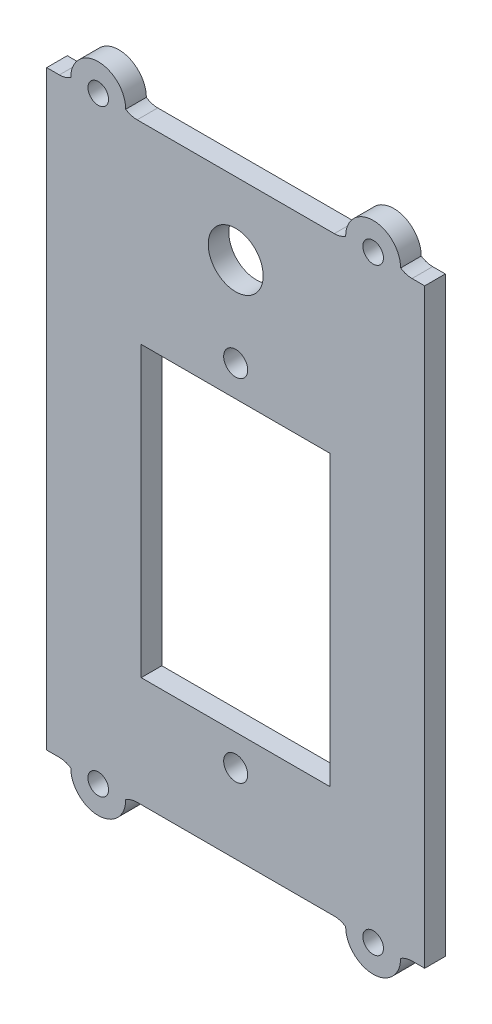
ISO-10303-21;
HEADER;
FILE_DESCRIPTION(('STEP AP214'),'2;1');
FILE_NAME('part.step','',(''),(''),'','','');
FILE_SCHEMA(('AUTOMOTIVE_DESIGN { 1 0 10303 214 1 1 1 1 }'));
ENDSEC;
DATA;
#1=APPLICATION_CONTEXT('core data for automotive mechanical design processes');
#2=APPLICATION_PROTOCOL_DEFINITION('international standard','automotive_design',2000,#1);
#3=PRODUCT_CONTEXT('',#1,'mechanical');
#4=PRODUCT('Part','Part','',(#3));
#5=PRODUCT_RELATED_PRODUCT_CATEGORY('part','',(#4));
#6=PRODUCT_DEFINITION_FORMATION('','',#4);
#7=PRODUCT_DEFINITION_CONTEXT('part definition',#1,'design');
#8=PRODUCT_DEFINITION('design','',#6,#7);
#9=PRODUCT_DEFINITION_SHAPE('','',#8);
#10=(LENGTH_UNIT() NAMED_UNIT(*) SI_UNIT(.MILLI.,.METRE.));
#11=(NAMED_UNIT(*) PLANE_ANGLE_UNIT() SI_UNIT($,.RADIAN.));
#12=(NAMED_UNIT(*) SI_UNIT($,.STERADIAN.) SOLID_ANGLE_UNIT());
#13=UNCERTAINTY_MEASURE_WITH_UNIT(LENGTH_MEASURE(1.E-05),#10,'distance_accuracy_value','');
#14=(GEOMETRIC_REPRESENTATION_CONTEXT(3) GLOBAL_UNCERTAINTY_ASSIGNED_CONTEXT((#13)) GLOBAL_UNIT_ASSIGNED_CONTEXT((#10,
#11,#12)) REPRESENTATION_CONTEXT('',''));
#15=CARTESIAN_POINT('',(0.,0.,0.));
#16=DIRECTION('',(0.,0.,1.));
#17=DIRECTION('',(1.,0.,0.));
#18=AXIS2_PLACEMENT_3D('',#15,#16,#17);
#19=CARTESIAN_POINT('',(-14.3416876048223,-46.,3.));
#20=DIRECTION('',(0.,0.,-1.));
#21=DIRECTION('',(-1.,0.,0.));
#22=AXIS2_PLACEMENT_3D('',#19,#20,#21);
#23=CYLINDRICAL_SURFACE('',#22,3.);
#24=CARTESIAN_POINT('',(-14.3416876048223,-46.,0.));
#25=DIRECTION('',(0.,0.,1.));
#26=DIRECTION('',(1.,0.,0.));
#27=AXIS2_PLACEMENT_3D('',#24,#25,#26);
#28=CIRCLE('',#27,3.);
#29=CARTESIAN_POINT('',(-14.3416876048223,-43.,0.));
#30=VERTEX_POINT('',#29);
#31=CARTESIAN_POINT('',(-16.,-43.5,0.));
#32=VERTEX_POINT('',#31);
#33=EDGE_CURVE('E305',#30,#32,#28,.T.);
#34=ORIENTED_EDGE('',*,*,#33,.F.);
#35=DIRECTION('',(0.,0.,-1.));
#36=VECTOR('',#35,1.);
#37=CARTESIAN_POINT('',(-14.3416876048223,-43.,3.));
#38=LINE('',#37,#36);
#39=CARTESIAN_POINT('',(-14.3416876048223,-43.,3.));
#40=VERTEX_POINT('',#39);
#41=EDGE_CURVE('E11',#40,#30,#38,.T.);
#42=ORIENTED_EDGE('',*,*,#41,.F.);
#43=CARTESIAN_POINT('',(-14.3416876048223,-46.,3.));
#44=DIRECTION('',(0.,0.,1.));
#45=DIRECTION('',(1.,0.,0.));
#46=AXIS2_PLACEMENT_3D('',#43,#44,#45);
#47=CIRCLE('',#46,3.);
#48=CARTESIAN_POINT('',(-16.,-43.5,3.));
#49=VERTEX_POINT('',#48);
#50=EDGE_CURVE('E243',#40,#49,#47,.T.);
#51=ORIENTED_EDGE('',*,*,#50,.T.);
#52=DIRECTION('',(0.,0.,-1.));
#53=VECTOR('',#52,1.);
#54=CARTESIAN_POINT('',(-16.,-43.5,3.));
#55=LINE('',#54,#53);
#56=EDGE_CURVE('E304',#49,#32,#55,.T.);
#57=ORIENTED_EDGE('',*,*,#56,.T.);
#58=EDGE_LOOP('',(#34,#42,#51,#57));
#59=FACE_BOUND('',#58,.T.);
#60=ADVANCED_FACE('F33',(#59),#23,.F.);
#61=CARTESIAN_POINT('',(0.,-43.,3.));
#62=DIRECTION('',(0.,1.,0.));
#63=DIRECTION('',(0.,0.,1.));
#64=AXIS2_PLACEMENT_3D('',#61,#62,#63);
#65=PLANE('',#64);
#66=DIRECTION('',(1.,0.,0.));
#67=VECTOR('',#66,1.);
#68=CARTESIAN_POINT('',(0.,-43.,0.));
#69=LINE('',#68,#67);
#70=CARTESIAN_POINT('',(14.3416876048223,-43.,0.));
#71=VERTEX_POINT('',#70);
#72=EDGE_CURVE('E308',#30,#71,#69,.T.);
#73=ORIENTED_EDGE('',*,*,#72,.T.);
#74=DIRECTION('',(0.,0.,-1.));
#75=VECTOR('',#74,1.);
#76=CARTESIAN_POINT('',(14.3416876048223,-43.,3.));
#77=LINE('',#76,#75);
#78=CARTESIAN_POINT('',(14.3416876048223,-43.,3.));
#79=VERTEX_POINT('',#78);
#80=EDGE_CURVE('E40',#79,#71,#77,.T.);
#81=ORIENTED_EDGE('',*,*,#80,.F.);
#82=DIRECTION('',(1.,0.,0.));
#83=VECTOR('',#82,1.);
#84=CARTESIAN_POINT('',(0.,-43.,3.));
#85=LINE('',#84,#83);
#86=EDGE_CURVE('E246',#40,#79,#85,.T.);
#87=ORIENTED_EDGE('',*,*,#86,.F.);
#88=ORIENTED_EDGE('',*,*,#41,.T.);
#89=EDGE_LOOP('',(#73,#81,#87,#88));
#90=FACE_BOUND('',#89,.T.);
#91=ADVANCED_FACE('F419',(#90),#65,.F.);
#92=CARTESIAN_POINT('',(14.3416876048223,-46.,3.));
#93=DIRECTION('',(0.,0.,-1.));
#94=DIRECTION('',(-1.,0.,0.));
#95=AXIS2_PLACEMENT_3D('',#92,#93,#94);
#96=CYLINDRICAL_SURFACE('',#95,3.);
#97=CARTESIAN_POINT('',(14.3416876048223,-46.,0.));
#98=DIRECTION('',(0.,0.,1.));
#99=DIRECTION('',(1.,0.,0.));
#100=AXIS2_PLACEMENT_3D('',#97,#98,#99);
#101=CIRCLE('',#100,3.);
#102=CARTESIAN_POINT('',(16.,-43.5,0.));
#103=VERTEX_POINT('',#102);
#104=EDGE_CURVE('E312',#103,#71,#101,.T.);
#105=ORIENTED_EDGE('',*,*,#104,.F.);
#106=DIRECTION('',(0.,0.,-1.));
#107=VECTOR('',#106,1.);
#108=CARTESIAN_POINT('',(16.,-43.5,3.));
#109=LINE('',#108,#107);
#110=CARTESIAN_POINT('',(16.,-43.5,3.));
#111=VERTEX_POINT('',#110);
#112=EDGE_CURVE('E410',#111,#103,#109,.T.);
#113=ORIENTED_EDGE('',*,*,#112,.F.);
#114=CARTESIAN_POINT('',(14.3416876048223,-46.,3.));
#115=DIRECTION('',(0.,0.,1.));
#116=DIRECTION('',(1.,0.,0.));
#117=AXIS2_PLACEMENT_3D('',#114,#115,#116);
#118=CIRCLE('',#117,3.);
#119=EDGE_CURVE('E249',#111,#79,#118,.T.);
#120=ORIENTED_EDGE('',*,*,#119,.T.);
#121=ORIENTED_EDGE('',*,*,#80,.T.);
#122=EDGE_LOOP('',(#105,#113,#120,#121));
#123=FACE_BOUND('',#122,.T.);
#124=ADVANCED_FACE('F414',(#123),#96,.F.);
#125=CARTESIAN_POINT('',(20.,-43.5,3.));
#126=DIRECTION('',(0.,0.,-1.));
#127=DIRECTION('',(-1.,0.,0.));
#128=AXIS2_PLACEMENT_3D('',#125,#126,#127);
#129=CYLINDRICAL_SURFACE('',#128,4.);
#130=CARTESIAN_POINT('',(20.,-43.5,0.));
#131=DIRECTION('',(0.,0.,1.));
#132=DIRECTION('',(1.,0.,0.));
#133=AXIS2_PLACEMENT_3D('',#130,#131,#132);
#134=CIRCLE('',#133,4.);
#135=CARTESIAN_POINT('',(24.,-43.5,0.));
#136=VERTEX_POINT('',#135);
#137=EDGE_CURVE('E315',#103,#136,#134,.T.);
#138=ORIENTED_EDGE('',*,*,#137,.T.);
#139=DIRECTION('',(0.,0.,-1.));
#140=VECTOR('',#139,1.);
#141=CARTESIAN_POINT('',(24.,-43.5,3.));
#142=LINE('',#141,#140);
#143=CARTESIAN_POINT('',(24.,-43.5,3.));
#144=VERTEX_POINT('',#143);
#145=EDGE_CURVE('E408',#144,#136,#142,.T.);
#146=ORIENTED_EDGE('',*,*,#145,.F.);
#147=CARTESIAN_POINT('',(20.,-43.5,3.));
#148=DIRECTION('',(0.,0.,1.));
#149=DIRECTION('',(1.,0.,0.));
#150=AXIS2_PLACEMENT_3D('',#147,#148,#149);
#151=CIRCLE('',#150,4.);
#152=EDGE_CURVE('E252',#111,#144,#151,.T.);
#153=ORIENTED_EDGE('',*,*,#152,.F.);
#154=ORIENTED_EDGE('',*,*,#112,.T.);
#155=EDGE_LOOP('',(#138,#146,#153,#154));
#156=FACE_BOUND('',#155,.T.);
#157=ADVANCED_FACE('F429',(#156),#129,.T.);
#158=CARTESIAN_POINT('',(25.6583123951777,-46.,3.));
#159=DIRECTION('',(0.,0.,-1.));
#160=DIRECTION('',(-1.,0.,0.));
#161=AXIS2_PLACEMENT_3D('',#158,#159,#160);
#162=CYLINDRICAL_SURFACE('',#161,3.);
#163=CARTESIAN_POINT('',(25.6583123951777,-46.,0.));
#164=DIRECTION('',(0.,0.,1.));
#165=DIRECTION('',(1.,0.,0.));
#166=AXIS2_PLACEMENT_3D('',#163,#164,#165);
#167=CIRCLE('',#166,3.);
#168=CARTESIAN_POINT('',(25.6583123951777,-43.,0.));
#169=VERTEX_POINT('',#168);
#170=EDGE_CURVE('E318',#169,#136,#167,.T.);
#171=ORIENTED_EDGE('',*,*,#170,.F.);
#172=DIRECTION('',(0.,0.,-1.));
#173=VECTOR('',#172,1.);
#174=CARTESIAN_POINT('',(25.6583123951777,-43.,3.));
#175=LINE('',#174,#173);
#176=CARTESIAN_POINT('',(25.6583123951777,-43.,3.));
#177=VERTEX_POINT('',#176);
#178=EDGE_CURVE('E406',#177,#169,#175,.T.);
#179=ORIENTED_EDGE('',*,*,#178,.F.);
#180=CARTESIAN_POINT('',(25.6583123951777,-46.,3.));
#181=DIRECTION('',(0.,0.,1.));
#182=DIRECTION('',(1.,0.,0.));
#183=AXIS2_PLACEMENT_3D('',#180,#181,#182);
#184=CIRCLE('',#183,3.);
#185=EDGE_CURVE('E254',#177,#144,#184,.T.);
#186=ORIENTED_EDGE('',*,*,#185,.T.);
#187=ORIENTED_EDGE('',*,*,#145,.T.);
#188=EDGE_LOOP('',(#171,#179,#186,#187));
#189=FACE_BOUND('',#188,.T.);
#190=ADVANCED_FACE('F504',(#189),#162,.F.);
#191=CARTESIAN_POINT('',(0.,-43.,3.));
#192=DIRECTION('',(0.,1.,0.));
#193=DIRECTION('',(0.,0.,1.));
#194=AXIS2_PLACEMENT_3D('',#191,#192,#193);
#195=PLANE('',#194);
#196=DIRECTION('',(1.,0.,0.));
#197=VECTOR('',#196,1.);
#198=CARTESIAN_POINT('',(0.,-43.,0.));
#199=LINE('',#198,#197);
#200=CARTESIAN_POINT('',(27.5,-43.,0.));
#201=VERTEX_POINT('',#200);
#202=EDGE_CURVE('E321',#169,#201,#199,.T.);
#203=ORIENTED_EDGE('',*,*,#202,.T.);
#204=DIRECTION('',(0.,0.,-1.));
#205=VECTOR('',#204,1.);
#206=CARTESIAN_POINT('',(27.5,-43.,3.));
#207=LINE('',#206,#205);
#208=CARTESIAN_POINT('',(27.5,-43.,3.));
#209=VERTEX_POINT('',#208);
#210=EDGE_CURVE('E403',#209,#201,#207,.T.);
#211=ORIENTED_EDGE('',*,*,#210,.F.);
#212=DIRECTION('',(1.,0.,0.));
#213=VECTOR('',#212,1.);
#214=CARTESIAN_POINT('',(0.,-43.,3.));
#215=LINE('',#214,#213);
#216=EDGE_CURVE('E257',#177,#209,#215,.T.);
#217=ORIENTED_EDGE('',*,*,#216,.F.);
#218=ORIENTED_EDGE('',*,*,#178,.T.);
#219=EDGE_LOOP('',(#203,#211,#217,#218));
#220=FACE_BOUND('',#219,.T.);
#221=ADVANCED_FACE('F502',(#220),#195,.F.);
#222=CARTESIAN_POINT('',(27.5,0.,3.));
#223=DIRECTION('',(-1.,0.,0.));
#224=DIRECTION('',(0.,-1.,0.));
#225=AXIS2_PLACEMENT_3D('',#222,#223,#224);
#226=PLANE('',#225);
#227=DIRECTION('',(0.,1.,0.));
#228=VECTOR('',#227,1.);
#229=CARTESIAN_POINT('',(27.5,0.,0.));
#230=LINE('',#229,#228);
#231=CARTESIAN_POINT('',(27.5,43.,0.));
#232=VERTEX_POINT('',#231);
#233=EDGE_CURVE('E323',#201,#232,#230,.T.);
#234=ORIENTED_EDGE('',*,*,#233,.T.);
#235=DIRECTION('',(0.,0.,-1.));
#236=VECTOR('',#235,1.);
#237=CARTESIAN_POINT('',(27.5,43.,3.));
#238=LINE('',#237,#236);
#239=CARTESIAN_POINT('',(27.5,43.,3.));
#240=VERTEX_POINT('',#239);
#241=EDGE_CURVE('E400',#240,#232,#238,.T.);
#242=ORIENTED_EDGE('',*,*,#241,.F.);
#243=DIRECTION('',(0.,1.,0.));
#244=VECTOR('',#243,1.);
#245=CARTESIAN_POINT('',(27.5,0.,3.));
#246=LINE('',#245,#244);
#247=EDGE_CURVE('E259',#209,#240,#246,.T.);
#248=ORIENTED_EDGE('',*,*,#247,.F.);
#249=ORIENTED_EDGE('',*,*,#210,.T.);
#250=EDGE_LOOP('',(#234,#242,#248,#249));
#251=FACE_BOUND('',#250,.T.);
#252=ADVANCED_FACE('F497',(#251),#226,.F.);
#253=CARTESIAN_POINT('',(0.,43.,3.));
#254=DIRECTION('',(0.,-1.,0.));
#255=DIRECTION('',(0.,0.,-1.));
#256=AXIS2_PLACEMENT_3D('',#253,#254,#255);
#257=PLANE('',#256);
#258=DIRECTION('',(-1.,0.,0.));
#259=VECTOR('',#258,1.);
#260=CARTESIAN_POINT('',(0.,43.,0.));
#261=LINE('',#260,#259);
#262=CARTESIAN_POINT('',(25.6583123951777,43.,0.));
#263=VERTEX_POINT('',#262);
#264=EDGE_CURVE('E325',#232,#263,#261,.T.);
#265=ORIENTED_EDGE('',*,*,#264,.T.);
#266=DIRECTION('',(0.,0.,-1.));
#267=VECTOR('',#266,1.);
#268=CARTESIAN_POINT('',(25.6583123951777,43.,3.));
#269=LINE('',#268,#267);
#270=CARTESIAN_POINT('',(25.6583123951777,43.,3.));
#271=VERTEX_POINT('',#270);
#272=EDGE_CURVE('E398',#271,#263,#269,.T.);
#273=ORIENTED_EDGE('',*,*,#272,.F.);
#274=DIRECTION('',(-1.,0.,0.));
#275=VECTOR('',#274,1.);
#276=CARTESIAN_POINT('',(0.,43.,3.));
#277=LINE('',#276,#275);
#278=EDGE_CURVE('E261',#240,#271,#277,.T.);
#279=ORIENTED_EDGE('',*,*,#278,.F.);
#280=ORIENTED_EDGE('',*,*,#241,.T.);
#281=EDGE_LOOP('',(#265,#273,#279,#280));
#282=FACE_BOUND('',#281,.T.);
#283=ADVANCED_FACE('F493',(#282),#257,.F.);
#284=CARTESIAN_POINT('',(25.6583123951777,46.,3.));
#285=DIRECTION('',(0.,0.,-1.));
#286=DIRECTION('',(-1.,0.,0.));
#287=AXIS2_PLACEMENT_3D('',#284,#285,#286);
#288=CYLINDRICAL_SURFACE('',#287,3.);
#289=CARTESIAN_POINT('',(25.6583123951777,46.,0.));
#290=DIRECTION('',(0.,0.,1.));
#291=DIRECTION('',(1.,0.,0.));
#292=AXIS2_PLACEMENT_3D('',#289,#290,#291);
#293=CIRCLE('',#292,3.);
#294=CARTESIAN_POINT('',(24.,43.5,0.));
#295=VERTEX_POINT('',#294);
#296=EDGE_CURVE('E328',#295,#263,#293,.T.);
#297=ORIENTED_EDGE('',*,*,#296,.F.);
#298=DIRECTION('',(0.,0.,-1.));
#299=VECTOR('',#298,1.);
#300=CARTESIAN_POINT('',(24.,43.5,3.));
#301=LINE('',#300,#299);
#302=CARTESIAN_POINT('',(24.,43.5,3.));
#303=VERTEX_POINT('',#302);
#304=EDGE_CURVE('E396',#303,#295,#301,.T.);
#305=ORIENTED_EDGE('',*,*,#304,.F.);
#306=CARTESIAN_POINT('',(25.6583123951777,46.,3.));
#307=DIRECTION('',(0.,0.,1.));
#308=DIRECTION('',(1.,0.,0.));
#309=AXIS2_PLACEMENT_3D('',#306,#307,#308);
#310=CIRCLE('',#309,3.);
#311=EDGE_CURVE('E263',#303,#271,#310,.T.);
#312=ORIENTED_EDGE('',*,*,#311,.T.);
#313=ORIENTED_EDGE('',*,*,#272,.T.);
#314=EDGE_LOOP('',(#297,#305,#312,#313));
#315=FACE_BOUND('',#314,.T.);
#316=ADVANCED_FACE('F488',(#315),#288,.F.);
#317=CARTESIAN_POINT('',(20.,43.5,3.));
#318=DIRECTION('',(0.,0.,-1.));
#319=DIRECTION('',(-1.,0.,0.));
#320=AXIS2_PLACEMENT_3D('',#317,#318,#319);
#321=CYLINDRICAL_SURFACE('',#320,4.);
#322=CARTESIAN_POINT('',(20.,43.5,0.));
#323=DIRECTION('',(0.,0.,1.));
#324=DIRECTION('',(1.,0.,0.));
#325=AXIS2_PLACEMENT_3D('',#322,#323,#324);
#326=CIRCLE('',#325,4.);
#327=CARTESIAN_POINT('',(16.,43.5,0.));
#328=VERTEX_POINT('',#327);
#329=EDGE_CURVE('E331',#295,#328,#326,.T.);
#330=ORIENTED_EDGE('',*,*,#329,.T.);
#331=DIRECTION('',(0.,0.,-1.));
#332=VECTOR('',#331,1.);
#333=CARTESIAN_POINT('',(16.,43.5,3.));
#334=LINE('',#333,#332);
#335=CARTESIAN_POINT('',(16.,43.5,3.));
#336=VERTEX_POINT('',#335);
#337=EDGE_CURVE('E394',#336,#328,#334,.T.);
#338=ORIENTED_EDGE('',*,*,#337,.F.);
#339=CARTESIAN_POINT('',(20.,43.5,3.));
#340=DIRECTION('',(0.,0.,1.));
#341=DIRECTION('',(1.,0.,0.));
#342=AXIS2_PLACEMENT_3D('',#339,#340,#341);
#343=CIRCLE('',#342,4.);
#344=EDGE_CURVE('E266',#303,#336,#343,.T.);
#345=ORIENTED_EDGE('',*,*,#344,.F.);
#346=ORIENTED_EDGE('',*,*,#304,.T.);
#347=EDGE_LOOP('',(#330,#338,#345,#346));
#348=FACE_BOUND('',#347,.T.);
#349=ADVANCED_FACE('F484',(#348),#321,.T.);
#350=CARTESIAN_POINT('',(14.3416876048223,46.,3.));
#351=DIRECTION('',(0.,0.,-1.));
#352=DIRECTION('',(-1.,0.,0.));
#353=AXIS2_PLACEMENT_3D('',#350,#351,#352);
#354=CYLINDRICAL_SURFACE('',#353,3.);
#355=CARTESIAN_POINT('',(14.3416876048223,46.,0.));
#356=DIRECTION('',(0.,0.,1.));
#357=DIRECTION('',(1.,0.,0.));
#358=AXIS2_PLACEMENT_3D('',#355,#356,#357);
#359=CIRCLE('',#358,3.);
#360=CARTESIAN_POINT('',(14.3416876048223,43.,0.));
#361=VERTEX_POINT('',#360);
#362=EDGE_CURVE('E334',#361,#328,#359,.T.);
#363=ORIENTED_EDGE('',*,*,#362,.F.);
#364=DIRECTION('',(0.,0.,-1.));
#365=VECTOR('',#364,1.);
#366=CARTESIAN_POINT('',(14.3416876048223,43.,3.));
#367=LINE('',#366,#365);
#368=CARTESIAN_POINT('',(14.3416876048223,43.,3.));
#369=VERTEX_POINT('',#368);
#370=EDGE_CURVE('E392',#369,#361,#367,.T.);
#371=ORIENTED_EDGE('',*,*,#370,.F.);
#372=CARTESIAN_POINT('',(14.3416876048223,46.,3.));
#373=DIRECTION('',(0.,0.,1.));
#374=DIRECTION('',(1.,0.,0.));
#375=AXIS2_PLACEMENT_3D('',#372,#373,#374);
#376=CIRCLE('',#375,3.);
#377=EDGE_CURVE('E268',#369,#336,#376,.T.);
#378=ORIENTED_EDGE('',*,*,#377,.T.);
#379=ORIENTED_EDGE('',*,*,#337,.T.);
#380=EDGE_LOOP('',(#363,#371,#378,#379));
#381=FACE_BOUND('',#380,.T.);
#382=ADVANCED_FACE('F479',(#381),#354,.F.);
#383=CARTESIAN_POINT('',(0.,43.,3.));
#384=DIRECTION('',(0.,-1.,0.));
#385=DIRECTION('',(0.,0.,-1.));
#386=AXIS2_PLACEMENT_3D('',#383,#384,#385);
#387=PLANE('',#386);
#388=DIRECTION('',(-1.,0.,0.));
#389=VECTOR('',#388,1.);
#390=CARTESIAN_POINT('',(0.,43.,0.));
#391=LINE('',#390,#389);
#392=CARTESIAN_POINT('',(-14.3416876048223,43.,0.));
#393=VERTEX_POINT('',#392);
#394=EDGE_CURVE('E337',#361,#393,#391,.T.);
#395=ORIENTED_EDGE('',*,*,#394,.T.);
#396=DIRECTION('',(0.,0.,-1.));
#397=VECTOR('',#396,1.);
#398=CARTESIAN_POINT('',(-14.3416876048223,43.,3.));
#399=LINE('',#398,#397);
#400=CARTESIAN_POINT('',(-14.3416876048223,43.,3.));
#401=VERTEX_POINT('',#400);
#402=EDGE_CURVE('E390',#401,#393,#399,.T.);
#403=ORIENTED_EDGE('',*,*,#402,.F.);
#404=DIRECTION('',(-1.,0.,0.));
#405=VECTOR('',#404,1.);
#406=CARTESIAN_POINT('',(0.,43.,3.));
#407=LINE('',#406,#405);
#408=EDGE_CURVE('E271',#369,#401,#407,.T.);
#409=ORIENTED_EDGE('',*,*,#408,.F.);
#410=ORIENTED_EDGE('',*,*,#370,.T.);
#411=EDGE_LOOP('',(#395,#403,#409,#410));
#412=FACE_BOUND('',#411,.T.);
#413=ADVANCED_FACE('F475',(#412),#387,.F.);
#414=CARTESIAN_POINT('',(-14.3416876048223,46.,3.));
#415=DIRECTION('',(0.,0.,-1.));
#416=DIRECTION('',(-1.,0.,0.));
#417=AXIS2_PLACEMENT_3D('',#414,#415,#416);
#418=CYLINDRICAL_SURFACE('',#417,3.);
#419=CARTESIAN_POINT('',(-14.3416876048223,46.,0.));
#420=DIRECTION('',(0.,0.,1.));
#421=DIRECTION('',(1.,0.,0.));
#422=AXIS2_PLACEMENT_3D('',#419,#420,#421);
#423=CIRCLE('',#422,3.);
#424=CARTESIAN_POINT('',(-16.,43.5,0.));
#425=VERTEX_POINT('',#424);
#426=EDGE_CURVE('E340',#425,#393,#423,.T.);
#427=ORIENTED_EDGE('',*,*,#426,.F.);
#428=DIRECTION('',(0.,0.,-1.));
#429=VECTOR('',#428,1.);
#430=CARTESIAN_POINT('',(-16.,43.5,3.));
#431=LINE('',#430,#429);
#432=CARTESIAN_POINT('',(-16.,43.5,3.));
#433=VERTEX_POINT('',#432);
#434=EDGE_CURVE('E388',#433,#425,#431,.T.);
#435=ORIENTED_EDGE('',*,*,#434,.F.);
#436=CARTESIAN_POINT('',(-14.3416876048223,46.,3.));
#437=DIRECTION('',(0.,0.,1.));
#438=DIRECTION('',(1.,0.,0.));
#439=AXIS2_PLACEMENT_3D('',#436,#437,#438);
#440=CIRCLE('',#439,3.);
#441=EDGE_CURVE('E273',#433,#401,#440,.T.);
#442=ORIENTED_EDGE('',*,*,#441,.T.);
#443=ORIENTED_EDGE('',*,*,#402,.T.);
#444=EDGE_LOOP('',(#427,#435,#442,#443));
#445=FACE_BOUND('',#444,.T.);
#446=ADVANCED_FACE('F469',(#445),#418,.F.);
#447=CARTESIAN_POINT('',(-20.,43.5,3.));
#448=DIRECTION('',(0.,0.,-1.));
#449=DIRECTION('',(-1.,0.,0.));
#450=AXIS2_PLACEMENT_3D('',#447,#448,#449);
#451=CYLINDRICAL_SURFACE('',#450,4.);
#452=CARTESIAN_POINT('',(-20.,43.5,0.));
#453=DIRECTION('',(0.,0.,1.));
#454=DIRECTION('',(1.,0.,0.));
#455=AXIS2_PLACEMENT_3D('',#452,#453,#454);
#456=CIRCLE('',#455,4.);
#457=CARTESIAN_POINT('',(-24.,43.5,0.));
#458=VERTEX_POINT('',#457);
#459=EDGE_CURVE('E343',#425,#458,#456,.T.);
#460=ORIENTED_EDGE('',*,*,#459,.T.);
#461=DIRECTION('',(0.,0.,-1.));
#462=VECTOR('',#461,1.);
#463=CARTESIAN_POINT('',(-24.,43.5,3.));
#464=LINE('',#463,#462);
#465=CARTESIAN_POINT('',(-24.,43.5,3.));
#466=VERTEX_POINT('',#465);
#467=EDGE_CURVE('E386',#466,#458,#464,.T.);
#468=ORIENTED_EDGE('',*,*,#467,.F.);
#469=CARTESIAN_POINT('',(-20.,43.5,3.));
#470=DIRECTION('',(0.,0.,1.));
#471=DIRECTION('',(1.,0.,0.));
#472=AXIS2_PLACEMENT_3D('',#469,#470,#471);
#473=CIRCLE('',#472,4.);
#474=EDGE_CURVE('E276',#433,#466,#473,.T.);
#475=ORIENTED_EDGE('',*,*,#474,.F.);
#476=ORIENTED_EDGE('',*,*,#434,.T.);
#477=EDGE_LOOP('',(#460,#468,#475,#476));
#478=FACE_BOUND('',#477,.T.);
#479=ADVANCED_FACE('F505',(#478),#451,.T.);
#480=CARTESIAN_POINT('',(-25.6583123951777,46.,3.));
#481=DIRECTION('',(0.,0.,-1.));
#482=DIRECTION('',(-1.,0.,0.));
#483=AXIS2_PLACEMENT_3D('',#480,#481,#482);
#484=CYLINDRICAL_SURFACE('',#483,3.);
#485=CARTESIAN_POINT('',(-25.6583123951777,46.,0.));
#486=DIRECTION('',(0.,0.,1.));
#487=DIRECTION('',(1.,0.,0.));
#488=AXIS2_PLACEMENT_3D('',#485,#486,#487);
#489=CIRCLE('',#488,3.);
#490=CARTESIAN_POINT('',(-25.6583123951777,43.,0.));
#491=VERTEX_POINT('',#490);
#492=EDGE_CURVE('E346',#491,#458,#489,.T.);
#493=ORIENTED_EDGE('',*,*,#492,.F.);
#494=DIRECTION('',(0.,0.,-1.));
#495=VECTOR('',#494,1.);
#496=CARTESIAN_POINT('',(-25.6583123951777,43.,3.));
#497=LINE('',#496,#495);
#498=CARTESIAN_POINT('',(-25.6583123951777,43.,3.));
#499=VERTEX_POINT('',#498);
#500=EDGE_CURVE('E384',#499,#491,#497,.T.);
#501=ORIENTED_EDGE('',*,*,#500,.F.);
#502=CARTESIAN_POINT('',(-25.6583123951777,46.,3.));
#503=DIRECTION('',(0.,0.,1.));
#504=DIRECTION('',(1.,0.,0.));
#505=AXIS2_PLACEMENT_3D('',#502,#503,#504);
#506=CIRCLE('',#505,3.);
#507=EDGE_CURVE('E278',#499,#466,#506,.T.);
#508=ORIENTED_EDGE('',*,*,#507,.T.);
#509=ORIENTED_EDGE('',*,*,#467,.T.);
#510=EDGE_LOOP('',(#493,#501,#508,#509));
#511=FACE_BOUND('',#510,.T.);
#512=ADVANCED_FACE('F462',(#511),#484,.F.);
#513=CARTESIAN_POINT('',(0.,43.,3.));
#514=DIRECTION('',(0.,-1.,0.));
#515=DIRECTION('',(0.,0.,-1.));
#516=AXIS2_PLACEMENT_3D('',#513,#514,#515);
#517=PLANE('',#516);
#518=DIRECTION('',(-1.,0.,0.));
#519=VECTOR('',#518,1.);
#520=CARTESIAN_POINT('',(0.,43.,0.));
#521=LINE('',#520,#519);
#522=CARTESIAN_POINT('',(-27.5,43.,0.));
#523=VERTEX_POINT('',#522);
#524=EDGE_CURVE('E349',#491,#523,#521,.T.);
#525=ORIENTED_EDGE('',*,*,#524,.T.);
#526=DIRECTION('',(0.,0.,-1.));
#527=VECTOR('',#526,1.);
#528=CARTESIAN_POINT('',(-27.5,43.,3.));
#529=LINE('',#528,#527);
#530=CARTESIAN_POINT('',(-27.5,43.,3.));
#531=VERTEX_POINT('',#530);
#532=EDGE_CURVE('E381',#531,#523,#529,.T.);
#533=ORIENTED_EDGE('',*,*,#532,.F.);
#534=DIRECTION('',(-1.,0.,0.));
#535=VECTOR('',#534,1.);
#536=CARTESIAN_POINT('',(0.,43.,3.));
#537=LINE('',#536,#535);
#538=EDGE_CURVE('E281',#499,#531,#537,.T.);
#539=ORIENTED_EDGE('',*,*,#538,.F.);
#540=ORIENTED_EDGE('',*,*,#500,.T.);
#541=EDGE_LOOP('',(#525,#533,#539,#540));
#542=FACE_BOUND('',#541,.T.);
#543=ADVANCED_FACE('F459',(#542),#517,.F.);
#544=CARTESIAN_POINT('',(-27.5,0.,3.));
#545=DIRECTION('',(1.,0.,0.));
#546=DIRECTION('',(0.,1.,0.));
#547=AXIS2_PLACEMENT_3D('',#544,#545,#546);
#548=PLANE('',#547);
#549=DIRECTION('',(0.,-1.,0.));
#550=VECTOR('',#549,1.);
#551=CARTESIAN_POINT('',(-27.5,0.,0.));
#552=LINE('',#551,#550);
#553=CARTESIAN_POINT('',(-27.5,-43.,0.));
#554=VERTEX_POINT('',#553);
#555=EDGE_CURVE('E351',#523,#554,#552,.T.);
#556=ORIENTED_EDGE('',*,*,#555,.T.);
#557=DIRECTION('',(0.,0.,-1.));
#558=VECTOR('',#557,1.);
#559=CARTESIAN_POINT('',(-27.5,-43.,3.));
#560=LINE('',#559,#558);
#561=CARTESIAN_POINT('',(-27.5,-43.,3.));
#562=VERTEX_POINT('',#561);
#563=EDGE_CURVE('E378',#562,#554,#560,.T.);
#564=ORIENTED_EDGE('',*,*,#563,.F.);
#565=DIRECTION('',(0.,-1.,0.));
#566=VECTOR('',#565,1.);
#567=CARTESIAN_POINT('',(-27.5,0.,3.));
#568=LINE('',#567,#566);
#569=EDGE_CURVE('E283',#531,#562,#568,.T.);
#570=ORIENTED_EDGE('',*,*,#569,.F.);
#571=ORIENTED_EDGE('',*,*,#532,.T.);
#572=EDGE_LOOP('',(#556,#564,#570,#571));
#573=FACE_BOUND('',#572,.T.);
#574=ADVANCED_FACE('F454',(#573),#548,.F.);
#575=CARTESIAN_POINT('',(0.,-43.,3.));
#576=DIRECTION('',(0.,1.,0.));
#577=DIRECTION('',(0.,0.,1.));
#578=AXIS2_PLACEMENT_3D('',#575,#576,#577);
#579=PLANE('',#578);
#580=DIRECTION('',(1.,0.,0.));
#581=VECTOR('',#580,1.);
#582=CARTESIAN_POINT('',(0.,-43.,0.));
#583=LINE('',#582,#581);
#584=CARTESIAN_POINT('',(-25.6583123951777,-43.,0.));
#585=VERTEX_POINT('',#584);
#586=EDGE_CURVE('E353',#554,#585,#583,.T.);
#587=ORIENTED_EDGE('',*,*,#586,.T.);
#588=DIRECTION('',(0.,0.,-1.));
#589=VECTOR('',#588,1.);
#590=CARTESIAN_POINT('',(-25.6583123951777,-43.,3.));
#591=LINE('',#590,#589);
#592=CARTESIAN_POINT('',(-25.6583123951777,-43.,3.));
#593=VERTEX_POINT('',#592);
#594=EDGE_CURVE('E376',#593,#585,#591,.T.);
#595=ORIENTED_EDGE('',*,*,#594,.F.);
#596=DIRECTION('',(1.,0.,0.));
#597=VECTOR('',#596,1.);
#598=CARTESIAN_POINT('',(0.,-43.,3.));
#599=LINE('',#598,#597);
#600=EDGE_CURVE('E285',#562,#593,#599,.T.);
#601=ORIENTED_EDGE('',*,*,#600,.F.);
#602=ORIENTED_EDGE('',*,*,#563,.T.);
#603=EDGE_LOOP('',(#587,#595,#601,#602));
#604=FACE_BOUND('',#603,.T.);
#605=ADVANCED_FACE('F448',(#604),#579,.F.);
#606=CARTESIAN_POINT('',(-25.6583123951777,-46.,3.));
#607=DIRECTION('',(0.,0.,-1.));
#608=DIRECTION('',(-1.,0.,0.));
#609=AXIS2_PLACEMENT_3D('',#606,#607,#608);
#610=CYLINDRICAL_SURFACE('',#609,3.);
#611=CARTESIAN_POINT('',(-25.6583123951777,-46.,0.));
#612=DIRECTION('',(0.,0.,1.));
#613=DIRECTION('',(1.,0.,0.));
#614=AXIS2_PLACEMENT_3D('',#611,#612,#613);
#615=CIRCLE('',#614,3.);
#616=CARTESIAN_POINT('',(-24.,-43.5,0.));
#617=VERTEX_POINT('',#616);
#618=EDGE_CURVE('E356',#617,#585,#615,.T.);
#619=ORIENTED_EDGE('',*,*,#618,.F.);
#620=DIRECTION('',(0.,0.,-1.));
#621=VECTOR('',#620,1.);
#622=CARTESIAN_POINT('',(-24.,-43.5,3.));
#623=LINE('',#622,#621);
#624=CARTESIAN_POINT('',(-24.,-43.5,3.));
#625=VERTEX_POINT('',#624);
#626=EDGE_CURVE('E374',#625,#617,#623,.T.);
#627=ORIENTED_EDGE('',*,*,#626,.F.);
#628=CARTESIAN_POINT('',(-25.6583123951777,-46.,3.));
#629=DIRECTION('',(0.,0.,1.));
#630=DIRECTION('',(1.,0.,0.));
#631=AXIS2_PLACEMENT_3D('',#628,#629,#630);
#632=CIRCLE('',#631,3.);
#633=EDGE_CURVE('E287',#625,#593,#632,.T.);
#634=ORIENTED_EDGE('',*,*,#633,.T.);
#635=ORIENTED_EDGE('',*,*,#594,.T.);
#636=EDGE_LOOP('',(#619,#627,#634,#635));
#637=FACE_BOUND('',#636,.T.);
#638=ADVANCED_FACE('F444',(#637),#610,.F.);
#639=CARTESIAN_POINT('',(20.,43.5,3.));
#640=DIRECTION('',(0.,0.,-1.));
#641=DIRECTION('',(-1.,0.,0.));
#642=AXIS2_PLACEMENT_3D('',#639,#640,#641);
#643=CYLINDRICAL_SURFACE('',#642,1.5);
#644=CARTESIAN_POINT('',(20.,43.5,3.));
#645=DIRECTION('',(0.,0.,1.));
#646=DIRECTION('',(1.,0.,0.));
#647=AXIS2_PLACEMENT_3D('',#644,#645,#646);
#648=CIRCLE('',#647,1.5);
#649=CARTESIAN_POINT('',(21.5,43.5,3.));
#650=VERTEX_POINT('',#649);
#651=EDGE_CURVE('E298',#650,#650,#648,.T.);
#652=ORIENTED_EDGE('',*,*,#651,.T.);
#653=EDGE_LOOP('',(#652));
#654=FACE_BOUND('',#653,.T.);
#655=CARTESIAN_POINT('',(20.,43.5,0.));
#656=DIRECTION('',(0.,0.,1.));
#657=DIRECTION('',(1.,0.,0.));
#658=AXIS2_PLACEMENT_3D('',#655,#656,#657);
#659=CIRCLE('',#658,1.5);
#660=CARTESIAN_POINT('',(21.5,43.5,0.));
#661=VERTEX_POINT('',#660);
#662=EDGE_CURVE('E368',#661,#661,#659,.T.);
#663=ORIENTED_EDGE('',*,*,#662,.F.);
#664=EDGE_LOOP('',(#663));
#665=FACE_BOUND('',#664,.T.);
#666=ADVANCED_FACE('F591',(#654,#665),#643,.F.);
#667=CARTESIAN_POINT('',(-20.,-43.5,3.));
#668=DIRECTION('',(0.,0.,-1.));
#669=DIRECTION('',(-1.,0.,0.));
#670=AXIS2_PLACEMENT_3D('',#667,#668,#669);
#671=CYLINDRICAL_SURFACE('',#670,1.5);
#672=CARTESIAN_POINT('',(-20.,-43.5,3.));
#673=DIRECTION('',(0.,0.,1.));
#674=DIRECTION('',(1.,0.,0.));
#675=AXIS2_PLACEMENT_3D('',#672,#673,#674);
#676=CIRCLE('',#675,1.5);
#677=CARTESIAN_POINT('',(-18.5,-43.5,3.));
#678=VERTEX_POINT('',#677);
#679=EDGE_CURVE('E295',#678,#678,#676,.T.);
#680=ORIENTED_EDGE('',*,*,#679,.T.);
#681=EDGE_LOOP('',(#680));
#682=FACE_BOUND('',#681,.T.);
#683=CARTESIAN_POINT('',(-20.,-43.5,0.));
#684=DIRECTION('',(0.,0.,1.));
#685=DIRECTION('',(1.,0.,0.));
#686=AXIS2_PLACEMENT_3D('',#683,#684,#685);
#687=CIRCLE('',#686,1.5);
#688=CARTESIAN_POINT('',(-18.5,-43.5,0.));
#689=VERTEX_POINT('',#688);
#690=EDGE_CURVE('E365',#689,#689,#687,.T.);
#691=ORIENTED_EDGE('',*,*,#690,.F.);
#692=EDGE_LOOP('',(#691));
#693=FACE_BOUND('',#692,.T.);
#694=ADVANCED_FACE('F600',(#682,#693),#671,.F.);
#695=CARTESIAN_POINT('',(20.,-43.5,3.));
#696=DIRECTION('',(0.,0.,-1.));
#697=DIRECTION('',(-1.,0.,0.));
#698=AXIS2_PLACEMENT_3D('',#695,#696,#697);
#699=CYLINDRICAL_SURFACE('',#698,1.5);
#700=CARTESIAN_POINT('',(20.,-43.5,3.));
#701=DIRECTION('',(0.,0.,1.));
#702=DIRECTION('',(1.,0.,0.));
#703=AXIS2_PLACEMENT_3D('',#700,#701,#702);
#704=CIRCLE('',#703,1.5);
#705=CARTESIAN_POINT('',(21.5,-43.5,3.));
#706=VERTEX_POINT('',#705);
#707=EDGE_CURVE('E292',#706,#706,#704,.T.);
#708=ORIENTED_EDGE('',*,*,#707,.T.);
#709=EDGE_LOOP('',(#708));
#710=FACE_BOUND('',#709,.T.);
#711=CARTESIAN_POINT('',(20.,-43.5,0.));
#712=DIRECTION('',(0.,0.,1.));
#713=DIRECTION('',(1.,0.,0.));
#714=AXIS2_PLACEMENT_3D('',#711,#712,#713);
#715=CIRCLE('',#714,1.5);
#716=CARTESIAN_POINT('',(21.5,-43.5,0.));
#717=VERTEX_POINT('',#716);
#718=EDGE_CURVE('E362',#717,#717,#715,.T.);
#719=ORIENTED_EDGE('',*,*,#718,.F.);
#720=EDGE_LOOP('',(#719));
#721=FACE_BOUND('',#720,.T.);
#722=ADVANCED_FACE('F610',(#710,#721),#699,.F.);
#723=CARTESIAN_POINT('',(-20.,-43.5,3.));
#724=DIRECTION('',(0.,0.,-1.));
#725=DIRECTION('',(-1.,0.,0.));
#726=AXIS2_PLACEMENT_3D('',#723,#724,#725);
#727=CYLINDRICAL_SURFACE('',#726,4.);
#728=CARTESIAN_POINT('',(-20.,-43.5,0.));
#729=DIRECTION('',(0.,0.,1.));
#730=DIRECTION('',(1.,0.,0.));
#731=AXIS2_PLACEMENT_3D('',#728,#729,#730);
#732=CIRCLE('',#731,4.);
#733=EDGE_CURVE('E359',#617,#32,#732,.T.);
#734=ORIENTED_EDGE('',*,*,#733,.T.);
#735=ORIENTED_EDGE('',*,*,#56,.F.);
#736=CARTESIAN_POINT('',(-20.,-43.5,3.));
#737=DIRECTION('',(0.,0.,1.));
#738=DIRECTION('',(1.,0.,0.));
#739=AXIS2_PLACEMENT_3D('',#736,#737,#738);
#740=CIRCLE('',#739,4.);
#741=EDGE_CURVE('E290',#625,#49,#740,.T.);
#742=ORIENTED_EDGE('',*,*,#741,.F.);
#743=ORIENTED_EDGE('',*,*,#626,.T.);
#744=EDGE_LOOP('',(#734,#735,#742,#743));
#745=FACE_BOUND('',#744,.T.);
#746=ADVANCED_FACE('F620',(#745),#727,.T.);
#747=CARTESIAN_POINT('',(-20.,43.5,3.));
#748=DIRECTION('',(0.,0.,-1.));
#749=DIRECTION('',(-1.,0.,0.));
#750=AXIS2_PLACEMENT_3D('',#747,#748,#749);
#751=CYLINDRICAL_SURFACE('',#750,1.5);
#752=CARTESIAN_POINT('',(-20.,43.5,3.));
#753=DIRECTION('',(0.,0.,1.));
#754=DIRECTION('',(1.,0.,0.));
#755=AXIS2_PLACEMENT_3D('',#752,#753,#754);
#756=CIRCLE('',#755,1.5);
#757=CARTESIAN_POINT('',(-18.5,43.5,3.));
#758=VERTEX_POINT('',#757);
#759=EDGE_CURVE('E301',#758,#758,#756,.T.);
#760=ORIENTED_EDGE('',*,*,#759,.T.);
#761=EDGE_LOOP('',(#760));
#762=FACE_BOUND('',#761,.T.);
#763=CARTESIAN_POINT('',(-20.,43.5,0.));
#764=DIRECTION('',(0.,0.,1.));
#765=DIRECTION('',(1.,0.,0.));
#766=AXIS2_PLACEMENT_3D('',#763,#764,#765);
#767=CIRCLE('',#766,1.5);
#768=CARTESIAN_POINT('',(-18.5,43.5,0.));
#769=VERTEX_POINT('',#768);
#770=EDGE_CURVE('E247',#769,#769,#767,.T.);
#771=ORIENTED_EDGE('',*,*,#770,.F.);
#772=EDGE_LOOP('',(#771));
#773=FACE_BOUND('',#772,.T.);
#774=ADVANCED_FACE('F630',(#762,#773),#751,.F.);
#775=CARTESIAN_POINT('',(0.,0.,3.));
#776=DIRECTION('',(0.,0.,1.));
#777=DIRECTION('',(1.,0.,0.));
#778=AXIS2_PLACEMENT_3D('',#775,#776,#777);
#779=PLANE('',#778);
#780=CARTESIAN_POINT('',(0.,32.5,3.));
#781=DIRECTION('',(0.,0.,1.));
#782=DIRECTION('',(1.,0.,0.));
#783=AXIS2_PLACEMENT_3D('',#780,#781,#782);
#784=CIRCLE('',#783,4.);
#785=CARTESIAN_POINT('',(4.,32.5,3.));
#786=VERTEX_POINT('',#785);
#787=EDGE_CURVE('E309',#786,#786,#784,.T.);
#788=ORIENTED_EDGE('',*,*,#787,.F.);
#789=EDGE_LOOP('',(#788));
#790=FACE_BOUND('',#789,.T.);
#791=DIRECTION('',(-1.,0.,0.));
#792=VECTOR('',#791,1.);
#793=CARTESIAN_POINT('',(-13.75,15.,3.));
#794=LINE('',#793,#792);
#795=CARTESIAN_POINT('',(13.75,15.,3.));
#796=VERTEX_POINT('',#795);
#797=CARTESIAN_POINT('',(-13.75,15.,3.));
#798=VERTEX_POINT('',#797);
#799=EDGE_CURVE('E200',#796,#798,#794,.T.);
#800=ORIENTED_EDGE('',*,*,#799,.F.);
#801=DIRECTION('',(0.,1.,0.));
#802=VECTOR('',#801,1.);
#803=CARTESIAN_POINT('',(13.75,15.,3.));
#804=LINE('',#803,#802);
#805=CARTESIAN_POINT('',(13.75,-27.,3.));
#806=VERTEX_POINT('',#805);
#807=EDGE_CURVE('E192',#806,#796,#804,.T.);
#808=ORIENTED_EDGE('',*,*,#807,.F.);
#809=DIRECTION('',(1.,0.,0.));
#810=VECTOR('',#809,1.);
#811=CARTESIAN_POINT('',(-13.75,-27.,3.));
#812=LINE('',#811,#810);
#813=CARTESIAN_POINT('',(-13.75,-27.,3.));
#814=VERTEX_POINT('',#813);
#815=EDGE_CURVE('E216',#814,#806,#812,.T.);
#816=ORIENTED_EDGE('',*,*,#815,.F.);
#817=DIRECTION('',(0.,-1.,0.));
#818=VECTOR('',#817,1.);
#819=CARTESIAN_POINT('',(-13.75,15.,3.));
#820=LINE('',#819,#818);
#821=EDGE_CURVE('E214',#798,#814,#820,.T.);
#822=ORIENTED_EDGE('',*,*,#821,.F.);
#823=EDGE_LOOP('',(#800,#808,#816,#822));
#824=FACE_BOUND('',#823,.T.);
#825=CARTESIAN_POINT('',(0.,19.5,3.));
#826=DIRECTION('',(0.,0.,1.));
#827=DIRECTION('',(1.,0.,0.));
#828=AXIS2_PLACEMENT_3D('',#825,#826,#827);
#829=CIRCLE('',#828,1.75);
#830=CARTESIAN_POINT('',(1.75,19.5,3.));
#831=VERTEX_POINT('',#830);
#832=EDGE_CURVE('E222',#831,#831,#829,.T.);
#833=ORIENTED_EDGE('',*,*,#832,.F.);
#834=EDGE_LOOP('',(#833));
#835=FACE_BOUND('',#834,.T.);
#836=CARTESIAN_POINT('',(0.,-31.5,3.));
#837=DIRECTION('',(0.,0.,1.));
#838=DIRECTION('',(1.,0.,0.));
#839=AXIS2_PLACEMENT_3D('',#836,#837,#838);
#840=CIRCLE('',#839,1.75);
#841=CARTESIAN_POINT('',(1.75,-31.5,3.));
#842=VERTEX_POINT('',#841);
#843=EDGE_CURVE('E237',#842,#842,#840,.T.);
#844=ORIENTED_EDGE('',*,*,#843,.F.);
#845=EDGE_LOOP('',(#844));
#846=FACE_BOUND('',#845,.T.);
#847=ORIENTED_EDGE('',*,*,#50,.F.);
#848=ORIENTED_EDGE('',*,*,#86,.T.);
#849=ORIENTED_EDGE('',*,*,#119,.F.);
#850=ORIENTED_EDGE('',*,*,#152,.T.);
#851=ORIENTED_EDGE('',*,*,#185,.F.);
#852=ORIENTED_EDGE('',*,*,#216,.T.);
#853=ORIENTED_EDGE('',*,*,#247,.T.);
#854=ORIENTED_EDGE('',*,*,#278,.T.);
#855=ORIENTED_EDGE('',*,*,#311,.F.);
#856=ORIENTED_EDGE('',*,*,#344,.T.);
#857=ORIENTED_EDGE('',*,*,#377,.F.);
#858=ORIENTED_EDGE('',*,*,#408,.T.);
#859=ORIENTED_EDGE('',*,*,#441,.F.);
#860=ORIENTED_EDGE('',*,*,#474,.T.);
#861=ORIENTED_EDGE('',*,*,#507,.F.);
#862=ORIENTED_EDGE('',*,*,#538,.T.);
#863=ORIENTED_EDGE('',*,*,#569,.T.);
#864=ORIENTED_EDGE('',*,*,#600,.T.);
#865=ORIENTED_EDGE('',*,*,#633,.F.);
#866=ORIENTED_EDGE('',*,*,#741,.T.);
#867=EDGE_LOOP('',(#847,#848,#849,#850,#851,#852,#853,#854,#855,#856,#857,#858,#859,#860,#861,
#862,#863,#864,#865,#866));
#868=FACE_BOUND('',#867,.T.);
#869=ORIENTED_EDGE('',*,*,#707,.F.);
#870=EDGE_LOOP('',(#869));
#871=FACE_BOUND('',#870,.T.);
#872=ORIENTED_EDGE('',*,*,#679,.F.);
#873=EDGE_LOOP('',(#872));
#874=FACE_BOUND('',#873,.T.);
#875=ORIENTED_EDGE('',*,*,#651,.F.);
#876=EDGE_LOOP('',(#875));
#877=FACE_BOUND('',#876,.T.);
#878=ORIENTED_EDGE('',*,*,#759,.F.);
#879=EDGE_LOOP('',(#878));
#880=FACE_BOUND('',#879,.T.);
#881=ADVANCED_FACE('F212',(#790,#824,#835,#846,#868,#871,#874,#877,#880),#779,.T.);
#882=CARTESIAN_POINT('',(0.,0.,0.));
#883=DIRECTION('',(0.,0.,1.));
#884=DIRECTION('',(1.,0.,0.));
#885=AXIS2_PLACEMENT_3D('',#882,#883,#884);
#886=PLANE('',#885);
#887=CARTESIAN_POINT('',(0.,32.5,0.));
#888=DIRECTION('',(0.,0.,1.));
#889=DIRECTION('',(1.,0.,0.));
#890=AXIS2_PLACEMENT_3D('',#887,#888,#889);
#891=CIRCLE('',#890,4.);
#892=CARTESIAN_POINT('',(4.,32.5,0.));
#893=VERTEX_POINT('',#892);
#894=EDGE_CURVE('E208',#893,#893,#891,.T.);
#895=ORIENTED_EDGE('',*,*,#894,.T.);
#896=EDGE_LOOP('',(#895));
#897=FACE_BOUND('',#896,.T.);
#898=DIRECTION('',(0.,1.,0.));
#899=VECTOR('',#898,1.);
#900=CARTESIAN_POINT('',(13.75,15.,0.));
#901=LINE('',#900,#899);
#902=CARTESIAN_POINT('',(13.75,-27.,0.));
#903=VERTEX_POINT('',#902);
#904=CARTESIAN_POINT('',(13.75,15.,0.));
#905=VERTEX_POINT('',#904);
#906=EDGE_CURVE('E55',#903,#905,#901,.T.);
#907=ORIENTED_EDGE('',*,*,#906,.T.);
#908=DIRECTION('',(-1.,0.,0.));
#909=VECTOR('',#908,1.);
#910=CARTESIAN_POINT('',(-13.75,15.,0.));
#911=LINE('',#910,#909);
#912=CARTESIAN_POINT('',(-13.75,15.,0.));
#913=VERTEX_POINT('',#912);
#914=EDGE_CURVE('E207',#905,#913,#911,.T.);
#915=ORIENTED_EDGE('',*,*,#914,.T.);
#916=DIRECTION('',(0.,-1.,0.));
#917=VECTOR('',#916,1.);
#918=CARTESIAN_POINT('',(-13.75,15.,0.));
#919=LINE('',#918,#917);
#920=CARTESIAN_POINT('',(-13.75,-27.,0.));
#921=VERTEX_POINT('',#920);
#922=EDGE_CURVE('E224',#913,#921,#919,.T.);
#923=ORIENTED_EDGE('',*,*,#922,.T.);
#924=DIRECTION('',(1.,0.,0.));
#925=VECTOR('',#924,1.);
#926=CARTESIAN_POINT('',(-13.75,-27.,0.));
#927=LINE('',#926,#925);
#928=EDGE_CURVE('E201',#921,#903,#927,.T.);
#929=ORIENTED_EDGE('',*,*,#928,.T.);
#930=EDGE_LOOP('',(#907,#915,#923,#929));
#931=FACE_BOUND('',#930,.T.);
#932=CARTESIAN_POINT('',(0.,19.5,0.));
#933=DIRECTION('',(0.,0.,1.));
#934=DIRECTION('',(1.,0.,0.));
#935=AXIS2_PLACEMENT_3D('',#932,#933,#934);
#936=CIRCLE('',#935,1.75);
#937=CARTESIAN_POINT('',(1.75,19.5,0.));
#938=VERTEX_POINT('',#937);
#939=EDGE_CURVE('E234',#938,#938,#936,.T.);
#940=ORIENTED_EDGE('',*,*,#939,.T.);
#941=EDGE_LOOP('',(#940));
#942=FACE_BOUND('',#941,.T.);
#943=CARTESIAN_POINT('',(0.,-31.5,0.));
#944=DIRECTION('',(0.,0.,1.));
#945=DIRECTION('',(1.,0.,0.));
#946=AXIS2_PLACEMENT_3D('',#943,#944,#945);
#947=CIRCLE('',#946,1.75);
#948=CARTESIAN_POINT('',(1.75,-31.5,0.));
#949=VERTEX_POINT('',#948);
#950=EDGE_CURVE('E240',#949,#949,#947,.T.);
#951=ORIENTED_EDGE('',*,*,#950,.T.);
#952=EDGE_LOOP('',(#951));
#953=FACE_BOUND('',#952,.T.);
#954=ORIENTED_EDGE('',*,*,#33,.T.);
#955=ORIENTED_EDGE('',*,*,#733,.F.);
#956=ORIENTED_EDGE('',*,*,#618,.T.);
#957=ORIENTED_EDGE('',*,*,#586,.F.);
#958=ORIENTED_EDGE('',*,*,#555,.F.);
#959=ORIENTED_EDGE('',*,*,#524,.F.);
#960=ORIENTED_EDGE('',*,*,#492,.T.);
#961=ORIENTED_EDGE('',*,*,#459,.F.);
#962=ORIENTED_EDGE('',*,*,#426,.T.);
#963=ORIENTED_EDGE('',*,*,#394,.F.);
#964=ORIENTED_EDGE('',*,*,#362,.T.);
#965=ORIENTED_EDGE('',*,*,#329,.F.);
#966=ORIENTED_EDGE('',*,*,#296,.T.);
#967=ORIENTED_EDGE('',*,*,#264,.F.);
#968=ORIENTED_EDGE('',*,*,#233,.F.);
#969=ORIENTED_EDGE('',*,*,#202,.F.);
#970=ORIENTED_EDGE('',*,*,#170,.T.);
#971=ORIENTED_EDGE('',*,*,#137,.F.);
#972=ORIENTED_EDGE('',*,*,#104,.T.);
#973=ORIENTED_EDGE('',*,*,#72,.F.);
#974=EDGE_LOOP('',(#954,#955,#956,#957,#958,#959,#960,#961,#962,#963,#964,#965,#966,#967,#968,
#969,#970,#971,#972,#973));
#975=FACE_BOUND('',#974,.T.);
#976=ORIENTED_EDGE('',*,*,#718,.T.);
#977=EDGE_LOOP('',(#976));
#978=FACE_BOUND('',#977,.T.);
#979=ORIENTED_EDGE('',*,*,#690,.T.);
#980=EDGE_LOOP('',(#979));
#981=FACE_BOUND('',#980,.T.);
#982=ORIENTED_EDGE('',*,*,#662,.T.);
#983=EDGE_LOOP('',(#982));
#984=FACE_BOUND('',#983,.T.);
#985=ORIENTED_EDGE('',*,*,#770,.T.);
#986=EDGE_LOOP('',(#985));
#987=FACE_BOUND('',#986,.T.);
#988=ADVANCED_FACE('F423',(#897,#931,#942,#953,#975,#978,#981,#984,#987),#886,.F.);
#989=CARTESIAN_POINT('',(0.,-31.5,3.));
#990=DIRECTION('',(0.,0.,-1.));
#991=DIRECTION('',(-1.,0.,0.));
#992=AXIS2_PLACEMENT_3D('',#989,#990,#991);
#993=CYLINDRICAL_SURFACE('',#992,1.75);
#994=ORIENTED_EDGE('',*,*,#843,.T.);
#995=EDGE_LOOP('',(#994));
#996=FACE_BOUND('',#995,.T.);
#997=ORIENTED_EDGE('',*,*,#950,.F.);
#998=EDGE_LOOP('',(#997));
#999=FACE_BOUND('',#998,.T.);
#1000=ADVANCED_FACE('F657',(#996,#999),#993,.F.);
#1001=CARTESIAN_POINT('',(0.,19.5,3.));
#1002=DIRECTION('',(0.,0.,-1.));
#1003=DIRECTION('',(-1.,0.,0.));
#1004=AXIS2_PLACEMENT_3D('',#1001,#1002,#1003);
#1005=CYLINDRICAL_SURFACE('',#1004,1.75);
#1006=ORIENTED_EDGE('',*,*,#832,.T.);
#1007=EDGE_LOOP('',(#1006));
#1008=FACE_BOUND('',#1007,.T.);
#1009=ORIENTED_EDGE('',*,*,#939,.F.);
#1010=EDGE_LOOP('',(#1009));
#1011=FACE_BOUND('',#1010,.T.);
#1012=ADVANCED_FACE('F667',(#1008,#1011),#1005,.F.);
#1013=CARTESIAN_POINT('',(13.75,15.,3.));
#1014=DIRECTION('',(-1.,0.,0.));
#1015=DIRECTION('',(0.,-1.,0.));
#1016=AXIS2_PLACEMENT_3D('',#1013,#1014,#1015);
#1017=PLANE('',#1016);
#1018=ORIENTED_EDGE('',*,*,#906,.F.);
#1019=DIRECTION('',(0.,0.,-1.));
#1020=VECTOR('',#1019,1.);
#1021=CARTESIAN_POINT('',(13.75,-27.,3.));
#1022=LINE('',#1021,#1020);
#1023=EDGE_CURVE('E196',#806,#903,#1022,.T.);
#1024=ORIENTED_EDGE('',*,*,#1023,.F.);
#1025=ORIENTED_EDGE('',*,*,#807,.T.);
#1026=DIRECTION('',(0.,0.,-1.));
#1027=VECTOR('',#1026,1.);
#1028=CARTESIAN_POINT('',(13.75,15.,3.));
#1029=LINE('',#1028,#1027);
#1030=EDGE_CURVE('E195',#796,#905,#1029,.T.);
#1031=ORIENTED_EDGE('',*,*,#1030,.T.);
#1032=EDGE_LOOP('',(#1018,#1024,#1025,#1031));
#1033=FACE_BOUND('',#1032,.T.);
#1034=ADVANCED_FACE('F194',(#1033),#1017,.T.);
#1035=CARTESIAN_POINT('',(-13.75,15.,3.));
#1036=DIRECTION('',(0.,-1.,0.));
#1037=DIRECTION('',(0.,0.,-1.));
#1038=AXIS2_PLACEMENT_3D('',#1035,#1036,#1037);
#1039=PLANE('',#1038);
#1040=ORIENTED_EDGE('',*,*,#914,.F.);
#1041=ORIENTED_EDGE('',*,*,#1030,.F.);
#1042=ORIENTED_EDGE('',*,*,#799,.T.);
#1043=DIRECTION('',(0.,0.,-1.));
#1044=VECTOR('',#1043,1.);
#1045=CARTESIAN_POINT('',(-13.75,15.,3.));
#1046=LINE('',#1045,#1044);
#1047=EDGE_CURVE('E209',#798,#913,#1046,.T.);
#1048=ORIENTED_EDGE('',*,*,#1047,.T.);
#1049=EDGE_LOOP('',(#1040,#1041,#1042,#1048));
#1050=FACE_BOUND('',#1049,.T.);
#1051=ADVANCED_FACE('F204',(#1050),#1039,.T.);
#1052=CARTESIAN_POINT('',(-13.75,15.,3.));
#1053=DIRECTION('',(1.,0.,0.));
#1054=DIRECTION('',(0.,1.,0.));
#1055=AXIS2_PLACEMENT_3D('',#1052,#1053,#1054);
#1056=PLANE('',#1055);
#1057=ORIENTED_EDGE('',*,*,#922,.F.);
#1058=ORIENTED_EDGE('',*,*,#1047,.F.);
#1059=ORIENTED_EDGE('',*,*,#821,.T.);
#1060=DIRECTION('',(0.,0.,-1.));
#1061=VECTOR('',#1060,1.);
#1062=CARTESIAN_POINT('',(-13.75,-27.,3.));
#1063=LINE('',#1062,#1061);
#1064=EDGE_CURVE('E47',#814,#921,#1063,.T.);
#1065=ORIENTED_EDGE('',*,*,#1064,.T.);
#1066=EDGE_LOOP('',(#1057,#1058,#1059,#1065));
#1067=FACE_BOUND('',#1066,.T.);
#1068=ADVANCED_FACE('F694',(#1067),#1056,.T.);
#1069=CARTESIAN_POINT('',(-13.75,-27.,3.));
#1070=DIRECTION('',(0.,1.,0.));
#1071=DIRECTION('',(0.,0.,1.));
#1072=AXIS2_PLACEMENT_3D('',#1069,#1070,#1071);
#1073=PLANE('',#1072);
#1074=ORIENTED_EDGE('',*,*,#928,.F.);
#1075=ORIENTED_EDGE('',*,*,#1064,.F.);
#1076=ORIENTED_EDGE('',*,*,#815,.T.);
#1077=ORIENTED_EDGE('',*,*,#1023,.T.);
#1078=EDGE_LOOP('',(#1074,#1075,#1076,#1077));
#1079=FACE_BOUND('',#1078,.T.);
#1080=ADVANCED_FACE('F703',(#1079),#1073,.T.);
#1081=CARTESIAN_POINT('',(0.,32.5,3.));
#1082=DIRECTION('',(0.,0.,-1.));
#1083=DIRECTION('',(-1.,0.,0.));
#1084=AXIS2_PLACEMENT_3D('',#1081,#1082,#1083);
#1085=CYLINDRICAL_SURFACE('',#1084,4.);
#1086=ORIENTED_EDGE('',*,*,#787,.T.);
#1087=EDGE_LOOP('',(#1086));
#1088=FACE_BOUND('',#1087,.T.);
#1089=ORIENTED_EDGE('',*,*,#894,.F.);
#1090=EDGE_LOOP('',(#1089));
#1091=FACE_BOUND('',#1090,.T.);
#1092=ADVANCED_FACE('F713',(#1088,#1091),#1085,.F.);
#1093=CLOSED_SHELL('',(#60,#91,#124,#157,#190,#221,#252,#283,#316,#349,#382,#413,#446,#479,#512,
#543,#574,#605,#638,#666,#694,#722,#746,#774,#881,#988,#1000,#1012,#1034,#1051,#1068,#1080,#1092));
#1094=MANIFOLD_SOLID_BREP('B2',#1093);
#1095=ADVANCED_BREP_SHAPE_REPRESENTATION('',(#18,#1094),#14);
#1096=SHAPE_DEFINITION_REPRESENTATION(#9,#1095);
ENDSEC;
END-ISO-10303-21;
